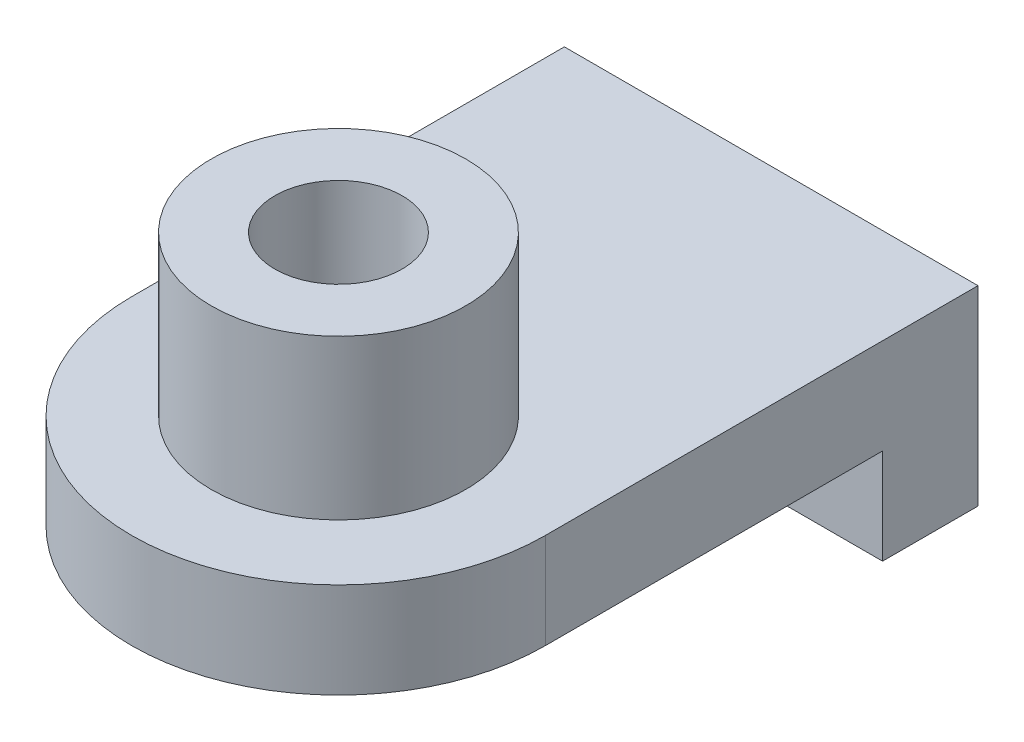
ISO-10303-21;
HEADER;
FILE_DESCRIPTION(('STEP AP214'),'2;1');
FILE_NAME('part.step','',(''),(''),'','','');
FILE_SCHEMA(('AUTOMOTIVE_DESIGN { 1 0 10303 214 1 1 1 1 }'));
ENDSEC;
DATA;
#1=APPLICATION_CONTEXT('core data for automotive mechanical design processes');
#2=APPLICATION_PROTOCOL_DEFINITION('international standard','automotive_design',2000,#1);
#3=PRODUCT_CONTEXT('',#1,'mechanical');
#4=PRODUCT('Part','Part','',(#3));
#5=PRODUCT_RELATED_PRODUCT_CATEGORY('part','',(#4));
#6=PRODUCT_DEFINITION_FORMATION('','',#4);
#7=PRODUCT_DEFINITION_CONTEXT('part definition',#1,'design');
#8=PRODUCT_DEFINITION('design','',#6,#7);
#9=PRODUCT_DEFINITION_SHAPE('','',#8);
#10=(LENGTH_UNIT() NAMED_UNIT(*) SI_UNIT(.MILLI.,.METRE.));
#11=(NAMED_UNIT(*) PLANE_ANGLE_UNIT() SI_UNIT($,.RADIAN.));
#12=(NAMED_UNIT(*) SI_UNIT($,.STERADIAN.) SOLID_ANGLE_UNIT());
#13=UNCERTAINTY_MEASURE_WITH_UNIT(LENGTH_MEASURE(1.E-05),#10,'distance_accuracy_value','');
#14=(GEOMETRIC_REPRESENTATION_CONTEXT(3) GLOBAL_UNCERTAINTY_ASSIGNED_CONTEXT((#13)) GLOBAL_UNIT_ASSIGNED_CONTEXT((#10,
#11,#12)) REPRESENTATION_CONTEXT('',''));
#15=CARTESIAN_POINT('',(0.,0.,0.));
#16=DIRECTION('',(0.,0.,1.));
#17=DIRECTION('',(1.,0.,0.));
#18=AXIS2_PLACEMENT_3D('',#15,#16,#17);
#19=CARTESIAN_POINT('',(0.,40.,0.));
#20=DIRECTION('',(0.,1.,0.));
#21=DIRECTION('',(0.,0.,1.));
#22=AXIS2_PLACEMENT_3D('',#19,#20,#21);
#23=PLANE('',#22);
#24=CARTESIAN_POINT('',(0.,40.,0.));
#25=DIRECTION('',(0.,1.,0.));
#26=DIRECTION('',(0.,0.,1.));
#27=AXIS2_PLACEMENT_3D('',#24,#25,#26);
#28=CIRCLE('',#27,20.);
#29=CARTESIAN_POINT('',(0.,40.,20.));
#30=VERTEX_POINT('',#29);
#31=EDGE_CURVE('E124',#30,#30,#28,.T.);
#32=ORIENTED_EDGE('',*,*,#31,.T.);
#33=EDGE_LOOP('',(#32));
#34=FACE_BOUND('',#33,.T.);
#35=CARTESIAN_POINT('',(0.,40.,0.));
#36=DIRECTION('',(0.,1.,0.));
#37=DIRECTION('',(0.,0.,1.));
#38=AXIS2_PLACEMENT_3D('',#35,#36,#37);
#39=CIRCLE('',#38,10.);
#40=CARTESIAN_POINT('',(0.,40.,10.));
#41=VERTEX_POINT('',#40);
#42=EDGE_CURVE('E194',#41,#41,#39,.T.);
#43=ORIENTED_EDGE('',*,*,#42,.F.);
#44=EDGE_LOOP('',(#43));
#45=FACE_BOUND('',#44,.T.);
#46=ADVANCED_FACE('F32',(#34,#45),#23,.T.);
#47=CARTESIAN_POINT('',(0.,15.,0.));
#48=DIRECTION('',(0.,-1.,0.));
#49=DIRECTION('',(0.,0.,-1.));
#50=AXIS2_PLACEMENT_3D('',#47,#48,#49);
#51=PLANE('',#50);
#52=CARTESIAN_POINT('',(0.,15.,0.));
#53=DIRECTION('',(0.,-1.,0.));
#54=DIRECTION('',(0.,0.,-1.));
#55=AXIS2_PLACEMENT_3D('',#52,#53,#54);
#56=CIRCLE('',#55,32.5);
#57=CARTESIAN_POINT('',(32.5,15.,0.));
#58=VERTEX_POINT('',#57);
#59=CARTESIAN_POINT('',(-32.5,15.,0.));
#60=VERTEX_POINT('',#59);
#61=EDGE_CURVE('E137',#58,#60,#56,.T.);
#62=ORIENTED_EDGE('',*,*,#61,.F.);
#63=DIRECTION('',(0.,0.,-1.));
#64=VECTOR('',#63,1.);
#65=CARTESIAN_POINT('',(32.5,15.,0.));
#66=LINE('',#65,#64);
#67=CARTESIAN_POINT('',(32.5,15.,-68.));
#68=VERTEX_POINT('',#67);
#69=EDGE_CURVE('E147',#58,#68,#66,.T.);
#70=ORIENTED_EDGE('',*,*,#69,.T.);
#71=DIRECTION('',(1.,0.,0.));
#72=VECTOR('',#71,1.);
#73=CARTESIAN_POINT('',(-32.5,15.,-68.));
#74=LINE('',#73,#72);
#75=CARTESIAN_POINT('',(-32.5,15.,-68.));
#76=VERTEX_POINT('',#75);
#77=EDGE_CURVE('E149',#76,#68,#74,.T.);
#78=ORIENTED_EDGE('',*,*,#77,.F.);
#79=DIRECTION('',(0.,0.,1.));
#80=VECTOR('',#79,1.);
#81=CARTESIAN_POINT('',(-32.5,15.,-68.));
#82=LINE('',#81,#80);
#83=EDGE_CURVE('E76',#76,#60,#82,.T.);
#84=ORIENTED_EDGE('',*,*,#83,.T.);
#85=EDGE_LOOP('',(#62,#70,#78,#84));
#86=FACE_BOUND('',#85,.T.);
#87=CARTESIAN_POINT('',(0.,15.,0.));
#88=DIRECTION('',(0.,-1.,0.));
#89=DIRECTION('',(0.,0.,-1.));
#90=AXIS2_PLACEMENT_3D('',#87,#88,#89);
#91=CIRCLE('',#90,20.);
#92=CARTESIAN_POINT('',(0.,15.,-20.));
#93=VERTEX_POINT('',#92);
#94=EDGE_CURVE('E11',#93,#93,#91,.F.);
#95=ORIENTED_EDGE('',*,*,#94,.F.);
#96=EDGE_LOOP('',(#95));
#97=FACE_BOUND('',#96,.T.);
#98=ADVANCED_FACE('F157',(#86,#97),#51,.F.);
#99=CARTESIAN_POINT('',(0.,0.,0.));
#100=DIRECTION('',(0.,-1.,0.));
#101=DIRECTION('',(0.,0.,-1.));
#102=AXIS2_PLACEMENT_3D('',#99,#100,#101);
#103=PLANE('',#102);
#104=DIRECTION('',(0.,0.,1.));
#105=VECTOR('',#104,1.);
#106=CARTESIAN_POINT('',(-32.5,0.,-68.));
#107=LINE('',#106,#105);
#108=CARTESIAN_POINT('',(-32.5,0.,-53.));
#109=VERTEX_POINT('',#108);
#110=CARTESIAN_POINT('',(-32.5,0.,0.));
#111=VERTEX_POINT('',#110);
#112=EDGE_CURVE('E138',#109,#111,#107,.T.);
#113=ORIENTED_EDGE('',*,*,#112,.F.);
#114=DIRECTION('',(1.,0.,0.));
#115=VECTOR('',#114,1.);
#116=CARTESIAN_POINT('',(-32.5,0.,-53.));
#117=LINE('',#116,#115);
#118=CARTESIAN_POINT('',(32.5,0.,-53.));
#119=VERTEX_POINT('',#118);
#120=EDGE_CURVE('E118',#109,#119,#117,.T.);
#121=ORIENTED_EDGE('',*,*,#120,.T.);
#122=DIRECTION('',(0.,0.,-1.));
#123=VECTOR('',#122,1.);
#124=CARTESIAN_POINT('',(32.5,0.,0.));
#125=LINE('',#124,#123);
#126=CARTESIAN_POINT('',(32.5,0.,0.));
#127=VERTEX_POINT('',#126);
#128=EDGE_CURVE('E134',#127,#119,#125,.T.);
#129=ORIENTED_EDGE('',*,*,#128,.F.);
#130=CARTESIAN_POINT('',(0.,0.,0.));
#131=DIRECTION('',(0.,-1.,0.));
#132=DIRECTION('',(0.,0.,-1.));
#133=AXIS2_PLACEMENT_3D('',#130,#131,#132);
#134=CIRCLE('',#133,32.5);
#135=EDGE_CURVE('E111',#127,#111,#134,.T.);
#136=ORIENTED_EDGE('',*,*,#135,.T.);
#137=EDGE_LOOP('',(#113,#121,#129,#136));
#138=FACE_BOUND('',#137,.T.);
#139=ADVANCED_FACE('F155',(#138),#103,.T.);
#140=CARTESIAN_POINT('',(0.,15.,0.));
#141=DIRECTION('',(0.,-1.,0.));
#142=DIRECTION('',(0.,0.,-1.));
#143=AXIS2_PLACEMENT_3D('',#140,#141,#142);
#144=CYLINDRICAL_SURFACE('',#143,32.5);
#145=ORIENTED_EDGE('',*,*,#135,.F.);
#146=DIRECTION('',(0.,-1.,0.));
#147=VECTOR('',#146,1.);
#148=CARTESIAN_POINT('',(32.5,15.,0.));
#149=LINE('',#148,#147);
#150=EDGE_CURVE('E40',#58,#127,#149,.T.);
#151=ORIENTED_EDGE('',*,*,#150,.F.);
#152=ORIENTED_EDGE('',*,*,#61,.T.);
#153=DIRECTION('',(0.,-1.,0.));
#154=VECTOR('',#153,1.);
#155=CARTESIAN_POINT('',(-32.5,15.,0.));
#156=LINE('',#155,#154);
#157=EDGE_CURVE('E102',#60,#111,#156,.T.);
#158=ORIENTED_EDGE('',*,*,#157,.T.);
#159=EDGE_LOOP('',(#145,#151,#152,#158));
#160=FACE_BOUND('',#159,.T.);
#161=ADVANCED_FACE('F34',(#160),#144,.T.);
#162=CARTESIAN_POINT('',(32.5,15.,0.));
#163=DIRECTION('',(-1.,0.,0.));
#164=DIRECTION('',(0.,0.,1.));
#165=AXIS2_PLACEMENT_3D('',#162,#163,#164);
#166=PLANE('',#165);
#167=ORIENTED_EDGE('',*,*,#128,.T.);
#168=DIRECTION('',(0.,1.,0.));
#169=VECTOR('',#168,1.);
#170=CARTESIAN_POINT('',(32.5,-15.,-53.));
#171=LINE('',#170,#169);
#172=CARTESIAN_POINT('',(32.5,-15.,-53.));
#173=VERTEX_POINT('',#172);
#174=EDGE_CURVE('E47',#173,#119,#171,.T.);
#175=ORIENTED_EDGE('',*,*,#174,.F.);
#176=DIRECTION('',(0.,0.,-1.));
#177=VECTOR('',#176,1.);
#178=CARTESIAN_POINT('',(32.5,-15.,-53.));
#179=LINE('',#178,#177);
#180=CARTESIAN_POINT('',(32.5,-15.,-68.));
#181=VERTEX_POINT('',#180);
#182=EDGE_CURVE('E120',#173,#181,#179,.T.);
#183=ORIENTED_EDGE('',*,*,#182,.T.);
#184=DIRECTION('',(0.,-1.,0.));
#185=VECTOR('',#184,1.);
#186=CARTESIAN_POINT('',(32.5,15.,-68.));
#187=LINE('',#186,#185);
#188=EDGE_CURVE('E101',#68,#181,#187,.T.);
#189=ORIENTED_EDGE('',*,*,#188,.F.);
#190=ORIENTED_EDGE('',*,*,#69,.F.);
#191=ORIENTED_EDGE('',*,*,#150,.T.);
#192=EDGE_LOOP('',(#167,#175,#183,#189,#190,#191));
#193=FACE_BOUND('',#192,.T.);
#194=ADVANCED_FACE('F156',(#193),#166,.F.);
#195=CARTESIAN_POINT('',(-32.5,15.,-68.));
#196=DIRECTION('',(0.,0.,-1.));
#197=DIRECTION('',(-1.,0.,0.));
#198=AXIS2_PLACEMENT_3D('',#195,#196,#197);
#199=PLANE('',#198);
#200=ORIENTED_EDGE('',*,*,#188,.T.);
#201=DIRECTION('',(1.,0.,0.));
#202=VECTOR('',#201,1.);
#203=CARTESIAN_POINT('',(-32.5,-15.,-68.));
#204=LINE('',#203,#202);
#205=CARTESIAN_POINT('',(-32.5,-15.,-68.));
#206=VERTEX_POINT('',#205);
#207=EDGE_CURVE('E105',#206,#181,#204,.T.);
#208=ORIENTED_EDGE('',*,*,#207,.F.);
#209=DIRECTION('',(0.,-1.,0.));
#210=VECTOR('',#209,1.);
#211=CARTESIAN_POINT('',(-32.5,15.,-68.));
#212=LINE('',#211,#210);
#213=EDGE_CURVE('E94',#76,#206,#212,.T.);
#214=ORIENTED_EDGE('',*,*,#213,.F.);
#215=ORIENTED_EDGE('',*,*,#77,.T.);
#216=EDGE_LOOP('',(#200,#208,#214,#215));
#217=FACE_BOUND('',#216,.T.);
#218=ADVANCED_FACE('F106',(#217),#199,.T.);
#219=CARTESIAN_POINT('',(-32.5,15.,-68.));
#220=DIRECTION('',(1.,0.,0.));
#221=DIRECTION('',(0.,0.,-1.));
#222=AXIS2_PLACEMENT_3D('',#219,#220,#221);
#223=PLANE('',#222);
#224=ORIENTED_EDGE('',*,*,#213,.T.);
#225=DIRECTION('',(0.,0.,-1.));
#226=VECTOR('',#225,1.);
#227=CARTESIAN_POINT('',(-32.5,-15.,-53.));
#228=LINE('',#227,#226);
#229=CARTESIAN_POINT('',(-32.5,-15.,-53.));
#230=VERTEX_POINT('',#229);
#231=EDGE_CURVE('E98',#230,#206,#228,.T.);
#232=ORIENTED_EDGE('',*,*,#231,.F.);
#233=DIRECTION('',(0.,1.,0.));
#234=VECTOR('',#233,1.);
#235=CARTESIAN_POINT('',(-32.5,-15.,-53.));
#236=LINE('',#235,#234);
#237=EDGE_CURVE('E116',#230,#109,#236,.T.);
#238=ORIENTED_EDGE('',*,*,#237,.T.);
#239=ORIENTED_EDGE('',*,*,#112,.T.);
#240=ORIENTED_EDGE('',*,*,#157,.F.);
#241=ORIENTED_EDGE('',*,*,#83,.F.);
#242=EDGE_LOOP('',(#224,#232,#238,#239,#240,#241));
#243=FACE_BOUND('',#242,.T.);
#244=ADVANCED_FACE('F96',(#243),#223,.F.);
#245=CARTESIAN_POINT('',(-32.5,-15.,-53.));
#246=DIRECTION('',(0.,-1.,0.));
#247=DIRECTION('',(0.,0.,-1.));
#248=AXIS2_PLACEMENT_3D('',#245,#246,#247);
#249=PLANE('',#248);
#250=ORIENTED_EDGE('',*,*,#182,.F.);
#251=DIRECTION('',(1.,0.,0.));
#252=VECTOR('',#251,1.);
#253=CARTESIAN_POINT('',(-32.5,-15.,-53.));
#254=LINE('',#253,#252);
#255=EDGE_CURVE('E112',#230,#173,#254,.T.);
#256=ORIENTED_EDGE('',*,*,#255,.F.);
#257=ORIENTED_EDGE('',*,*,#231,.T.);
#258=ORIENTED_EDGE('',*,*,#207,.T.);
#259=EDGE_LOOP('',(#250,#256,#257,#258));
#260=FACE_BOUND('',#259,.T.);
#261=ADVANCED_FACE('F114',(#260),#249,.T.);
#262=CARTESIAN_POINT('',(-32.5,-15.,-53.));
#263=DIRECTION('',(0.,0.,-1.));
#264=DIRECTION('',(-1.,0.,0.));
#265=AXIS2_PLACEMENT_3D('',#262,#263,#264);
#266=PLANE('',#265);
#267=ORIENTED_EDGE('',*,*,#174,.T.);
#268=ORIENTED_EDGE('',*,*,#120,.F.);
#269=ORIENTED_EDGE('',*,*,#237,.F.);
#270=ORIENTED_EDGE('',*,*,#255,.T.);
#271=EDGE_LOOP('',(#267,#268,#269,#270));
#272=FACE_BOUND('',#271,.T.);
#273=ADVANCED_FACE('F166',(#272),#266,.F.);
#274=CARTESIAN_POINT('',(0.,40.,0.));
#275=DIRECTION('',(0.,-1.,0.));
#276=DIRECTION('',(0.,0.,-1.));
#277=AXIS2_PLACEMENT_3D('',#274,#275,#276);
#278=CYLINDRICAL_SURFACE('',#277,20.);
#279=ORIENTED_EDGE('',*,*,#31,.F.);
#280=EDGE_LOOP('',(#279));
#281=FACE_BOUND('',#280,.T.);
#282=ORIENTED_EDGE('',*,*,#94,.T.);
#283=EDGE_LOOP('',(#282));
#284=FACE_BOUND('',#283,.T.);
#285=ADVANCED_FACE('F163',(#281,#284),#278,.T.);
#286=CARTESIAN_POINT('',(0.,40.,0.));
#287=DIRECTION('',(0.,1.,0.));
#288=DIRECTION('',(0.,0.,1.));
#289=AXIS2_PLACEMENT_3D('',#286,#287,#288);
#290=CYLINDRICAL_SURFACE('',#289,10.);
#291=ORIENTED_EDGE('',*,*,#42,.T.);
#292=EDGE_LOOP('',(#291));
#293=FACE_BOUND('',#292,.T.);
#294=CARTESIAN_POINT('',(0.,15.,0.));
#295=DIRECTION('',(0.,-1.,0.));
#296=DIRECTION('',(0.,0.,-1.));
#297=AXIS2_PLACEMENT_3D('',#294,#295,#296);
#298=CIRCLE('',#297,10.);
#299=CARTESIAN_POINT('',(0.,15.,-10.));
#300=VERTEX_POINT('',#299);
#301=EDGE_CURVE('E192',#300,#300,#298,.T.);
#302=ORIENTED_EDGE('',*,*,#301,.T.);
#303=EDGE_LOOP('',(#302));
#304=FACE_BOUND('',#303,.T.);
#305=ADVANCED_FACE('F165',(#293,#304),#290,.F.);
#306=CARTESIAN_POINT('',(0.,15.,0.));
#307=DIRECTION('',(0.,-1.,0.));
#308=DIRECTION('',(0.,0.,-1.));
#309=AXIS2_PLACEMENT_3D('',#306,#307,#308);
#310=PLANE('',#309);
#311=ORIENTED_EDGE('',*,*,#301,.F.);
#312=EDGE_LOOP('',(#311));
#313=FACE_BOUND('',#312,.T.);
#314=ADVANCED_FACE('F173',(#313),#310,.F.);
#315=CLOSED_SHELL('',(#46,#98,#139,#161,#194,#218,#244,#261,#273,#285,#305,#314));
#316=MANIFOLD_SOLID_BREP('B2',#315);
#317=ADVANCED_BREP_SHAPE_REPRESENTATION('',(#18,#316),#14);
#318=SHAPE_DEFINITION_REPRESENTATION(#9,#317);
ENDSEC;
END-ISO-10303-21;
